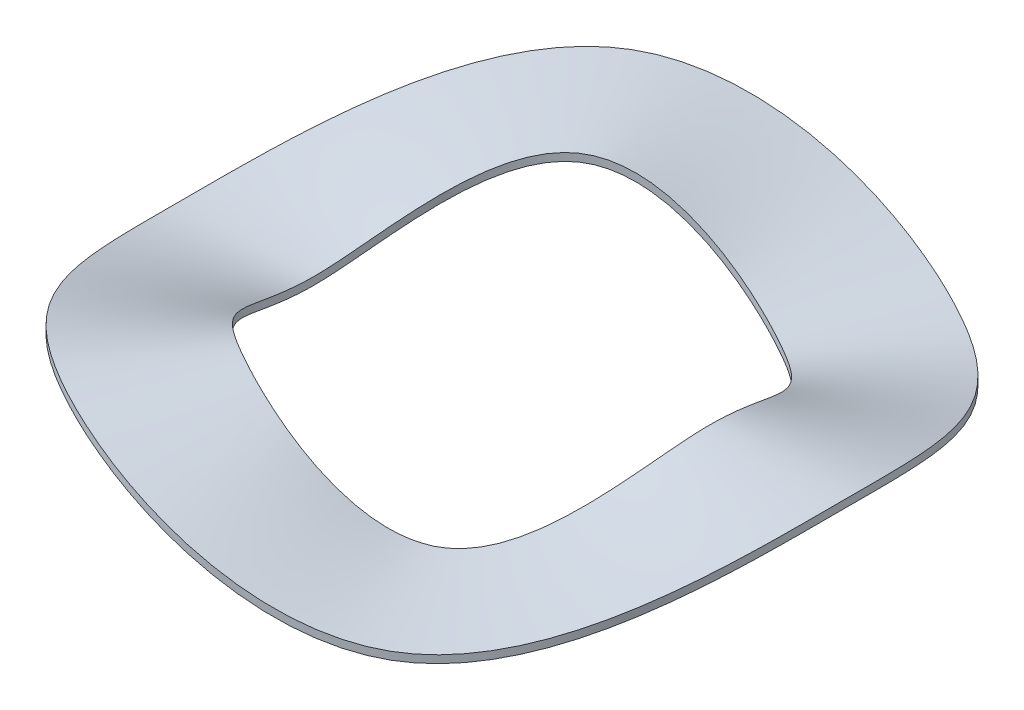
ISO-10303-21;
HEADER;
FILE_DESCRIPTION(('STEP AP214'),'2;1');
FILE_NAME('part.step','',(''),(''),'','','');
FILE_SCHEMA(('AUTOMOTIVE_DESIGN { 1 0 10303 214 1 1 1 1 }'));
ENDSEC;
DATA;
#1=APPLICATION_CONTEXT('core data for automotive mechanical design processes');
#2=APPLICATION_PROTOCOL_DEFINITION('international standard','automotive_design',2000,#1);
#3=PRODUCT_CONTEXT('',#1,'mechanical');
#4=PRODUCT('Part','Part','',(#3));
#5=PRODUCT_RELATED_PRODUCT_CATEGORY('part','',(#4));
#6=PRODUCT_DEFINITION_FORMATION('','',#4);
#7=PRODUCT_DEFINITION_CONTEXT('part definition',#1,'design');
#8=PRODUCT_DEFINITION('design','',#6,#7);
#9=PRODUCT_DEFINITION_SHAPE('','',#8);
#10=(LENGTH_UNIT() NAMED_UNIT(*) SI_UNIT(.MILLI.,.METRE.));
#11=(NAMED_UNIT(*) PLANE_ANGLE_UNIT() SI_UNIT($,.RADIAN.));
#12=(NAMED_UNIT(*) SI_UNIT($,.STERADIAN.) SOLID_ANGLE_UNIT());
#13=UNCERTAINTY_MEASURE_WITH_UNIT(LENGTH_MEASURE(1.E-05),#10,'distance_accuracy_value','');
#14=(GEOMETRIC_REPRESENTATION_CONTEXT(3) GLOBAL_UNCERTAINTY_ASSIGNED_CONTEXT((#13)) GLOBAL_UNIT_ASSIGNED_CONTEXT((#10,
#11,#12)) REPRESENTATION_CONTEXT('',''));
#15=CARTESIAN_POINT('',(0.,0.,0.));
#16=DIRECTION('',(0.,0.,1.));
#17=DIRECTION('',(1.,0.,0.));
#18=AXIS2_PLACEMENT_3D('',#15,#16,#17);
#19=CARTESIAN_POINT('',(-10.922,0.254,0.));
#20=CARTESIAN_POINT('',(-10.9219999999927,0.254000000001745,-0.189174589207381));
#21=CARTESIAN_POINT('',(-10.9110779999769,0.265557000005589,-0.567523767622859));
#22=CARTESIAN_POINT('',(-10.8627481499505,0.314096400012182,-1.1336287258289));
#23=CARTESIAN_POINT('',(-10.7832905999218,0.390372600019362,-1.69689606519844));
#24=CARTESIAN_POINT('',(-10.1246939997764,0.993648000028794,-5.05096153168188));
#25=CARTESIAN_POINT('',(-5.67943999942999,4.41451999999651,-11.3504753525087));
#26=CARTESIAN_POINT('',(6.55319999965251,-2.05740000005235,-11.3504753522481));
#27=CARTESIAN_POINT('',(13.106400000034,4.87680000000164,7.50304630708562E-11));
#28=CARTESIAN_POINT('',(6.55320000016817,-2.05740000000001,11.3504753520633));
#29=CARTESIAN_POINT('',(-5.67944000003358,4.41451999999847,11.3504753520914));
#30=CARTESIAN_POINT('',(-10.1246940001226,0.993647999976584,5.05096153178853));
#31=CARTESIAN_POINT('',(-10.7832906000527,0.390372599988579,1.69689606518149));
#32=CARTESIAN_POINT('',(-10.8627481500382,0.314096399991399,1.13362872582144));
#33=CARTESIAN_POINT('',(-10.9110780000209,0.26555699999512,0.567523767621429));
#34=CARTESIAN_POINT('',(-10.9220000000073,0.253999999998255,0.189174589207382));
#35=CARTESIAN_POINT('',(-10.922,0.254,0.));
#36=CARTESIAN_POINT('',(-9.46573333333333,0.254,0.));
#37=CARTESIAN_POINT('',(-9.46573333332698,0.254000000001745,-0.163951310646397));
#38=CARTESIAN_POINT('',(-9.45626759998001,0.265557000005589,-0.491853931939812));
#39=CARTESIAN_POINT('',(-9.41438172995713,0.314096400012181,-0.982478229051714));
#40=CARTESIAN_POINT('',(-9.34551851993219,0.390372600019362,-1.47064325650531));
#41=CARTESIAN_POINT('',(-8.77473479980619,0.993648000028794,-4.3774999941243));
#42=CARTESIAN_POINT('',(-4.92218133283933,4.41451999999651,-9.83707863884087));
#43=CARTESIAN_POINT('',(5.67943999969884,-2.05740000005235,-9.83707863861498));
#44=CARTESIAN_POINT('',(11.3588800000295,4.87680000000164,6.50259197616104E-11));
#45=CARTESIAN_POINT('',(5.67944000014575,-2.05740000000001,9.83707863845485));
#46=CARTESIAN_POINT('',(-4.92218133336243,4.41451999999847,9.83707863847919));
#47=CARTESIAN_POINT('',(-8.77473480010628,0.993647999976584,4.37749999421673));
#48=CARTESIAN_POINT('',(-9.34551852004565,0.390372599988579,1.47064325649063));
#49=CARTESIAN_POINT('',(-9.41438173003315,0.314096399991398,0.982478229045252));
#50=CARTESIAN_POINT('',(-9.45626760001813,0.265556999995119,0.491853931938572));
#51=CARTESIAN_POINT('',(-9.46573333333969,0.253999999998255,0.163951310646398));
#52=CARTESIAN_POINT('',(-9.46573333333333,0.254,0.));
#53=CARTESIAN_POINT('',(-8.00946666666667,0.254,0.));
#54=CARTESIAN_POINT('',(-8.00946666666129,0.254000000001745,-0.138728032085413));
#55=CARTESIAN_POINT('',(-8.00145719998308,0.265557000005589,-0.416184096256764));
#56=CARTESIAN_POINT('',(-7.96601530996372,0.314096400012182,-0.831327732274528));
#57=CARTESIAN_POINT('',(-7.90774643994262,0.390372600019362,-1.24439044781219));
#58=CARTESIAN_POINT('',(-7.42477559983601,0.993648000028794,-3.70403845656671));
#59=CARTESIAN_POINT('',(-4.16492266624866,4.41451999999651,-8.32368192517305));
#60=CARTESIAN_POINT('',(4.80567999974518,-2.05740000005235,-8.32368192498191));
#61=CARTESIAN_POINT('',(9.61136000002494,4.87680000000164,5.50217423705979E-11));
#62=CARTESIAN_POINT('',(4.80568000012333,-2.05740000000001,8.32368192484641));
#63=CARTESIAN_POINT('',(-4.16492266669129,4.41451999999847,8.323681924867));
#64=CARTESIAN_POINT('',(-7.42477560008993,0.993647999976584,3.70403845664492));
#65=CARTESIAN_POINT('',(-7.90774644003862,0.390372599988579,1.24439044779976));
#66=CARTESIAN_POINT('',(-7.96601531002805,0.314096399991399,0.831327732269059));
#67=CARTESIAN_POINT('',(-8.00145720001534,0.26555699999512,0.416184096255715));
#68=CARTESIAN_POINT('',(-8.00946666667204,0.253999999998255,0.138728032085413));
#69=CARTESIAN_POINT('',(-8.00946666666667,0.254,0.));
#70=CARTESIAN_POINT('',(-6.5532,0.254,0.));
#71=CARTESIAN_POINT('',(-6.5531999999956,0.254000000001745,-0.113504753524429));
#72=CARTESIAN_POINT('',(-6.54664679998616,0.265557000005589,-0.340514260573716));
#73=CARTESIAN_POINT('',(-6.51764888997032,0.314096400012182,-0.680177235497341));
#74=CARTESIAN_POINT('',(-6.46997435995305,0.390372600019362,-1.01813763911906));
#75=CARTESIAN_POINT('',(-6.07481639986583,0.993648000028794,-3.03057691900913));
#76=CARTESIAN_POINT('',(-3.407663999658,4.41451999999651,-6.81028521150522));
#77=CARTESIAN_POINT('',(3.93191999979151,-2.05740000005235,-6.81028521134883));
#78=CARTESIAN_POINT('',(7.8638400000204,4.87680000000164,4.50172532714607E-11));
#79=CARTESIAN_POINT('',(3.93192000010091,-2.05740000000001,6.81028521123798));
#80=CARTESIAN_POINT('',(-3.40766400002015,4.41451999999847,6.81028521125482));
#81=CARTESIAN_POINT('',(-6.07481640007358,0.993647999976584,3.03057691907312));
#82=CARTESIAN_POINT('',(-6.4699743600316,0.390372599988579,1.0181376391089));
#83=CARTESIAN_POINT('',(-6.51764889002295,0.314096399991399,0.680177235492866));
#84=CARTESIAN_POINT('',(-6.54664680001255,0.26555699999512,0.340514260572857));
#85=CARTESIAN_POINT('',(-6.5532000000044,0.253999999998255,0.113504753524429));
#86=CARTESIAN_POINT('',(-6.5532,0.254,0.));
#87=B_SPLINE_SURFACE_WITH_KNOTS('',3,3,((#19,#20,#21,#22,#23,#24,#25,#26,#27,#28,#29,#30,#31,
#32,#33,#34,#35),(#36,#37,#38,#39,#40,#41,#42,#43,#44,#45,#46,#47,#48,#49,#50,#51,#52),(#53,#54,
#55,#56,#57,#58,#59,#60,#61,#62,#63,#64,#65,#66,#67,#68,#69),(#70,#71,#72,#73,#74,#75,#76,#77,
#78,#79,#80,#81,#82,#83,#84,#85,#86)),.UNSPECIFIED.,.F.,.T.,.F.,(4,4),(4,1,1,1,1,1,1,1,1,1,1,1,
1,1,4),(0.,1.),(0.,0.0083333333333333,0.0166666666666666,0.0250000000000001,0.0333333333333334,
0.166666666657779,0.333333333333334,0.5,0.66666666666946,0.833333333333334,0.966666666666667,
0.975,0.983333333333333,0.991666666666667,1.),.UNSPECIFIED.);
#88=CARTESIAN_POINT('',(-10.922,0.254,0.));
#89=CARTESIAN_POINT('',(-10.9219999999927,0.254000000001745,-0.189174589207381));
#90=CARTESIAN_POINT('',(-10.9110779999769,0.265557000005589,-0.567523767622859));
#91=CARTESIAN_POINT('',(-10.8627481499505,0.314096400012182,-1.1336287258289));
#92=CARTESIAN_POINT('',(-10.7832905999218,0.390372600019362,-1.69689606519844));
#93=CARTESIAN_POINT('',(-10.1246939997764,0.993648000028794,-5.05096153168188));
#94=CARTESIAN_POINT('',(-5.67943999942999,4.41451999999651,-11.3504753525087));
#95=CARTESIAN_POINT('',(6.55319999965251,-2.05740000005235,-11.3504753522481));
#96=CARTESIAN_POINT('',(13.106400000034,4.87680000000164,7.50304630708562E-11));
#97=CARTESIAN_POINT('',(6.55320000016817,-2.05740000000001,11.3504753520633));
#98=CARTESIAN_POINT('',(-5.67944000003358,4.41451999999847,11.3504753520914));
#99=CARTESIAN_POINT('',(-10.1246940001226,0.993647999976584,5.05096153178853));
#100=CARTESIAN_POINT('',(-10.7832906000527,0.390372599988579,1.69689606518149));
#101=CARTESIAN_POINT('',(-10.8627481500382,0.314096399991399,1.13362872582144));
#102=CARTESIAN_POINT('',(-10.9110780000209,0.26555699999512,0.567523767621429));
#103=CARTESIAN_POINT('',(-10.9220000000073,0.253999999998255,0.189174589207382));
#104=CARTESIAN_POINT('',(-10.922,0.254,0.));
#105=B_SPLINE_CURVE_WITH_KNOTS('',3,(#88,#89,#90,#91,#92,#93,#94,#95,#96,#97,#98,#99,#100,#101,
#102,#103,#104),.UNSPECIFIED.,.T.,.F.,(4,1,1,1,1,1,1,1,1,1,1,1,1,1,4),(0.,0.0083333333333333,
0.0166666666666666,0.0250000000000001,0.0333333333333334,0.166666666657779,0.333333333333334,
0.5,0.66666666666946,0.833333333333334,0.966666666666667,0.975,0.983333333333333,
0.991666666666667,1.),.UNSPECIFIED.);
#106=CARTESIAN_POINT('',(-10.922,0.254,0.));
#107=VERTEX_POINT('',#106);
#108=EDGE_CURVE('E11',#107,#107,#105,.F.);
#109=CARTESIAN_POINT('',(-6.5532,0.254,0.));
#110=CARTESIAN_POINT('',(-6.5531999999956,0.254000000001745,-0.113504753524429));
#111=CARTESIAN_POINT('',(-6.54664679998616,0.265557000005589,-0.340514260573716));
#112=CARTESIAN_POINT('',(-6.51764888997032,0.314096400012182,-0.680177235497341));
#113=CARTESIAN_POINT('',(-6.46997435995305,0.390372600019362,-1.01813763911906));
#114=CARTESIAN_POINT('',(-6.07481639986583,0.993648000028794,-3.03057691900913));
#115=CARTESIAN_POINT('',(-3.407663999658,4.41451999999651,-6.81028521150522));
#116=CARTESIAN_POINT('',(3.93191999979151,-2.05740000005235,-6.81028521134883));
#117=CARTESIAN_POINT('',(7.8638400000204,4.87680000000164,4.50172532714607E-11));
#118=CARTESIAN_POINT('',(3.93192000010091,-2.05740000000001,6.81028521123798));
#119=CARTESIAN_POINT('',(-3.40766400002015,4.41451999999847,6.81028521125482));
#120=CARTESIAN_POINT('',(-6.07481640007358,0.993647999976584,3.03057691907312));
#121=CARTESIAN_POINT('',(-6.4699743600316,0.390372599988579,1.0181376391089));
#122=CARTESIAN_POINT('',(-6.51764889002295,0.314096399991399,0.680177235492866));
#123=CARTESIAN_POINT('',(-6.54664680001255,0.26555699999512,0.340514260572857));
#124=CARTESIAN_POINT('',(-6.5532000000044,0.253999999998255,0.113504753524429));
#125=CARTESIAN_POINT('',(-6.5532,0.254,0.));
#126=B_SPLINE_CURVE_WITH_KNOTS('',3,(#109,#110,#111,#112,#113,#114,#115,#116,#117,#118,#119,
#120,#121,#122,#123,#124,#125),.UNSPECIFIED.,.T.,.F.,(4,1,1,1,1,1,1,1,1,1,1,1,1,1,4),(0.,
0.0083333333333333,0.0166666666666666,0.0250000000000001,0.0333333333333334,0.166666666657779,
0.333333333333334,0.5,0.66666666666946,0.833333333333334,0.966666666666667,0.975,
0.983333333333333,0.991666666666667,1.),.UNSPECIFIED.);
#127=CARTESIAN_POINT('',(-6.5532,0.254,0.));
#128=VERTEX_POINT('',#127);
#129=EDGE_CURVE('E58',#128,#128,#126,.T.);
#130=ORIENTED_EDGE('',*,*,#108,.T.);
#131=EDGE_LOOP('',(#130));
#132=FACE_BOUND('',#131,.T.);
#133=ORIENTED_EDGE('',*,*,#129,.T.);
#134=EDGE_LOOP('',(#133));
#135=FACE_BOUND('',#134,.T.);
#136=ADVANCED_FACE('F46',(#132,#135),#87,.T.);
#137=CARTESIAN_POINT('',(-10.922,0.,0.));
#138=CARTESIAN_POINT('',(-10.9219999999927,1.74474726387461E-12,-0.189174589207381));
#139=CARTESIAN_POINT('',(-10.9110779999769,0.0115570000055891,-0.567523767622859));
#140=CARTESIAN_POINT('',(-10.8627481499505,0.0600964000121815,-1.1336287258289));
#141=CARTESIAN_POINT('',(-10.7832905999218,0.136372600019362,-1.69689606519843));
#142=CARTESIAN_POINT('',(-10.1246939997764,0.739648000028794,-5.05096153168188));
#143=CARTESIAN_POINT('',(-5.67943999942999,4.16051999999651,-11.3504753525087));
#144=CARTESIAN_POINT('',(6.55319999965251,-2.31140000005235,-11.3504753522481));
#145=CARTESIAN_POINT('',(13.106400000034,4.62280000000164,7.50308018840351E-11));
#146=CARTESIAN_POINT('',(6.55320000016817,-2.31140000000001,11.3504753520633));
#147=CARTESIAN_POINT('',(-5.67944000003358,4.16051999999847,11.3504753520914));
#148=CARTESIAN_POINT('',(-10.1246940001226,0.739647999976584,5.05096153178853));
#149=CARTESIAN_POINT('',(-10.7832906000527,0.136372599988579,1.69689606518149));
#150=CARTESIAN_POINT('',(-10.8627481500383,0.0600963999913984,1.13362872582144));
#151=CARTESIAN_POINT('',(-10.9110780000209,0.0115569999951193,0.567523767621429));
#152=CARTESIAN_POINT('',(-10.9220000000073,-1.74519957946845E-12,0.189174589207381));
#153=CARTESIAN_POINT('',(-10.922,0.,0.));
#154=CARTESIAN_POINT('',(-10.922,0.0211666666666664,0.));
#155=CARTESIAN_POINT('',(-10.9219999999927,0.0211666666684114,-0.189174589207381));
#156=CARTESIAN_POINT('',(-10.9110779999769,0.0327236666722557,-0.567523767622859));
#157=CARTESIAN_POINT('',(-10.8627481499505,0.081263066678848,-1.1336287258289));
#158=CARTESIAN_POINT('',(-10.7832905999218,0.157539266686028,-1.69689606519843));
#159=CARTESIAN_POINT('',(-10.1246939997764,0.760814666695461,-5.05096153168188));
#160=CARTESIAN_POINT('',(-5.67943999942999,4.18168666666318,-11.3504753525087));
#161=CARTESIAN_POINT('',(6.55319999965251,-2.29023333338569,-11.3504753522481));
#162=CARTESIAN_POINT('',(13.106400000034,4.6439666666683,7.50307747789808E-11));
#163=CARTESIAN_POINT('',(6.55320000016817,-2.29023333333334,11.3504753520633));
#164=CARTESIAN_POINT('',(-5.67944000003357,4.18168666666513,11.3504753520914));
#165=CARTESIAN_POINT('',(-10.1246940001226,0.760814666643251,5.05096153178853));
#166=CARTESIAN_POINT('',(-10.7832906000527,0.157539266655246,1.69689606518149));
#167=CARTESIAN_POINT('',(-10.8627481500382,0.0812630666580651,1.13362872582144));
#168=CARTESIAN_POINT('',(-10.9110780000209,0.032723666661786,0.567523767621429));
#169=CARTESIAN_POINT('',(-10.9220000000073,0.0211666666649214,0.189174589207381));
#170=CARTESIAN_POINT('',(-10.922,0.0211666666666664,0.));
#171=CARTESIAN_POINT('',(-10.922,0.0634999999999999,0.));
#172=CARTESIAN_POINT('',(-10.9219999999927,0.0635000000017448,-0.189174589207382));
#173=CARTESIAN_POINT('',(-10.9110779999769,0.0750570000055892,-0.56752376762286));
#174=CARTESIAN_POINT('',(-10.8627481499505,0.123596400012181,-1.1336287258289));
#175=CARTESIAN_POINT('',(-10.7832905999218,0.199872600019361,-1.69689606519843));
#176=CARTESIAN_POINT('',(-10.1246939997764,0.803148000028793,-5.05096153168188));
#177=CARTESIAN_POINT('',(-5.67943999942998,4.22401999999651,-11.3504753525087));
#178=CARTESIAN_POINT('',(6.55319999965251,-2.24790000005235,-11.350475352248));
#179=CARTESIAN_POINT('',(13.106400000034,4.68630000000164,7.50282269038755E-11));
#180=CARTESIAN_POINT('',(6.55320000016818,-2.2479,11.3504753520633));
#181=CARTESIAN_POINT('',(-5.67944000003358,4.22401999999846,11.3504753520914));
#182=CARTESIAN_POINT('',(-10.1246940001226,0.803147999976584,5.05096153178853));
#183=CARTESIAN_POINT('',(-10.7832906000527,0.199872599988579,1.69689606518149));
#184=CARTESIAN_POINT('',(-10.8627481500383,0.123596399991399,1.13362872582144));
#185=CARTESIAN_POINT('',(-10.9110780000209,0.0750569999951194,0.567523767621429));
#186=CARTESIAN_POINT('',(-10.9220000000073,0.0634999999982549,0.189174589207381));
#187=CARTESIAN_POINT('',(-10.922,0.0634999999999999,0.));
#188=CARTESIAN_POINT('',(-10.922,0.127,0.));
#189=CARTESIAN_POINT('',(-10.9219999999927,0.127000000001745,-0.189174589207382));
#190=CARTESIAN_POINT('',(-10.9110779999769,0.138557000005589,-0.56752376762286));
#191=CARTESIAN_POINT('',(-10.8627481499505,0.187096400012182,-1.1336287258289));
#192=CARTESIAN_POINT('',(-10.7832905999217,0.263372600019362,-1.69689606519844));
#193=CARTESIAN_POINT('',(-10.1246939997764,0.866648000028796,-5.05096153168189));
#194=CARTESIAN_POINT('',(-5.67943999943,4.28751999999652,-11.3504753525087));
#195=CARTESIAN_POINT('',(6.5531999996525,-2.18440000005236,-11.3504753522481));
#196=CARTESIAN_POINT('',(13.106400000034,4.74980000000165,7.5038431956824E-11));
#197=CARTESIAN_POINT('',(6.55320000016817,-2.18440000000001,11.3504753520633));
#198=CARTESIAN_POINT('',(-5.67944000003357,4.28751999999848,11.3504753520914));
#199=CARTESIAN_POINT('',(-10.1246940001226,0.866647999976585,5.05096153178853));
#200=CARTESIAN_POINT('',(-10.7832906000527,0.263372599988579,1.69689606518149));
#201=CARTESIAN_POINT('',(-10.8627481500382,0.187096399991399,1.13362872582144));
#202=CARTESIAN_POINT('',(-10.9110780000209,0.13855699999512,0.567523767621429));
#203=CARTESIAN_POINT('',(-10.9220000000073,0.126999999998255,0.189174589207382));
#204=CARTESIAN_POINT('',(-10.922,0.127,0.));
#205=CARTESIAN_POINT('',(-10.922,0.1905,0.));
#206=CARTESIAN_POINT('',(-10.9219999999927,0.190500000001745,-0.189174589207382));
#207=CARTESIAN_POINT('',(-10.9110779999769,0.202057000005589,-0.56752376762286));
#208=CARTESIAN_POINT('',(-10.8627481499505,0.250596400012182,-1.1336287258289));
#209=CARTESIAN_POINT('',(-10.7832905999218,0.326872600019362,-1.69689606519843));
#210=CARTESIAN_POINT('',(-10.1246939997764,0.930148000028793,-5.05096153168188));
#211=CARTESIAN_POINT('',(-5.67943999942999,4.35101999999651,-11.3504753525087));
#212=CARTESIAN_POINT('',(6.55319999965251,-2.12090000005235,-11.350475352248));
#213=CARTESIAN_POINT('',(13.106400000034,4.81330000000163,7.5022453527307E-11));
#214=CARTESIAN_POINT('',(6.55320000016818,-2.1209,11.3504753520633));
#215=CARTESIAN_POINT('',(-5.67944000003358,4.35101999999846,11.3504753520914));
#216=CARTESIAN_POINT('',(-10.1246940001226,0.930147999976583,5.05096153178852));
#217=CARTESIAN_POINT('',(-10.7832906000527,0.326872599988579,1.69689606518149));
#218=CARTESIAN_POINT('',(-10.8627481500383,0.250596399991399,1.13362872582144));
#219=CARTESIAN_POINT('',(-10.9110780000209,0.20205699999512,0.567523767621428));
#220=CARTESIAN_POINT('',(-10.9220000000073,0.190499999998255,0.189174589207381));
#221=CARTESIAN_POINT('',(-10.922,0.1905,0.));
#222=CARTESIAN_POINT('',(-10.922,0.232833333333333,0.));
#223=CARTESIAN_POINT('',(-10.9219999999927,0.232833333335078,-0.189174589207381));
#224=CARTESIAN_POINT('',(-10.9110779999769,0.244390333338923,-0.567523767622859));
#225=CARTESIAN_POINT('',(-10.8627481499505,0.292929733345515,-1.1336287258289));
#226=CARTESIAN_POINT('',(-10.7832905999218,0.369205933352695,-1.69689606519843));
#227=CARTESIAN_POINT('',(-10.1246939997764,0.972481333362128,-5.05096153168188));
#228=CARTESIAN_POINT('',(-5.67943999942999,4.39335333332985,-11.3504753525087));
#229=CARTESIAN_POINT('',(6.55319999965251,-2.07856666671902,-11.3504753522481));
#230=CARTESIAN_POINT('',(13.106400000034,4.85563333333497,7.50293382111022E-11));
#231=CARTESIAN_POINT('',(6.55320000016818,-2.07856666666667,11.3504753520633));
#232=CARTESIAN_POINT('',(-5.67944000003357,4.3933533333318,11.3504753520914));
#233=CARTESIAN_POINT('',(-10.1246940001226,0.972481333309917,5.05096153178853));
#234=CARTESIAN_POINT('',(-10.7832906000527,0.369205933321913,1.69689606518149));
#235=CARTESIAN_POINT('',(-10.8627481500382,0.292929733324732,1.13362872582144));
#236=CARTESIAN_POINT('',(-10.9110780000209,0.244390333328453,0.567523767621429));
#237=CARTESIAN_POINT('',(-10.9220000000073,0.232833333331588,0.189174589207382));
#238=CARTESIAN_POINT('',(-10.922,0.232833333333333,0.));
#239=CARTESIAN_POINT('',(-10.922,0.254,0.));
#240=CARTESIAN_POINT('',(-10.9219999999927,0.254000000001745,-0.189174589207381));
#241=CARTESIAN_POINT('',(-10.9110779999769,0.265557000005589,-0.567523767622859));
#242=CARTESIAN_POINT('',(-10.8627481499505,0.314096400012182,-1.1336287258289));
#243=CARTESIAN_POINT('',(-10.7832905999218,0.390372600019362,-1.69689606519843));
#244=CARTESIAN_POINT('',(-10.1246939997764,0.993648000028794,-5.05096153168188));
#245=CARTESIAN_POINT('',(-5.67943999942999,4.41451999999651,-11.3504753525087));
#246=CARTESIAN_POINT('',(6.55319999965251,-2.05740000005235,-11.3504753522481));
#247=CARTESIAN_POINT('',(13.106400000034,4.87680000000164,7.50300836000958E-11));
#248=CARTESIAN_POINT('',(6.55320000016818,-2.05740000000001,11.3504753520633));
#249=CARTESIAN_POINT('',(-5.67944000003358,4.41451999999847,11.3504753520914));
#250=CARTESIAN_POINT('',(-10.1246940001226,0.993647999976584,5.05096153178853));
#251=CARTESIAN_POINT('',(-10.7832906000527,0.390372599988579,1.69689606518149));
#252=CARTESIAN_POINT('',(-10.8627481500382,0.314096399991399,1.13362872582144));
#253=CARTESIAN_POINT('',(-10.9110780000209,0.26555699999512,0.567523767621429));
#254=CARTESIAN_POINT('',(-10.9220000000073,0.253999999998255,0.189174589207382));
#255=CARTESIAN_POINT('',(-10.922,0.254,0.));
#256=B_SPLINE_SURFACE_WITH_KNOTS('',3,3,((#137,#138,#139,#140,#141,#142,#143,#144,#145,#146,
#147,#148,#149,#150,#151,#152,#153),(#154,#155,#156,#157,#158,#159,#160,#161,#162,#163,#164,
#165,#166,#167,#168,#169,#170),(#171,#172,#173,#174,#175,#176,#177,#178,#179,#180,#181,#182,
#183,#184,#185,#186,#187),(#188,#189,#190,#191,#192,#193,#194,#195,#196,#197,#198,#199,#200,
#201,#202,#203,#204),(#205,#206,#207,#208,#209,#210,#211,#212,#213,#214,#215,#216,#217,#218,
#219,#220,#221),(#222,#223,#224,#225,#226,#227,#228,#229,#230,#231,#232,#233,#234,#235,#236,
#237,#238),(#239,#240,#241,#242,#243,#244,#245,#246,#247,#248,#249,#250,#251,#252,#253,#254,
#255)),.UNSPECIFIED.,.F.,.T.,.F.,(4,1,1,1,4),(4,1,1,1,1,1,1,1,1,1,1,1,1,1,4),(0.947916666666667,
0.9609375,0.973958333333333,0.986979166666667,1.),(0.,0.0083333333333333,0.0166666666666666,
0.0250000000000001,0.0333333333333334,0.166666666657779,0.333333333333334,0.5,0.66666666666946,
0.833333333333334,0.966666666666667,0.975,0.983333333333333,0.991666666666667,1.),.UNSPECIFIED.);
#257=CARTESIAN_POINT('',(-10.922,0.,0.));
#258=CARTESIAN_POINT('',(-10.9219999999927,1.74474726387461E-12,-0.189174589207381));
#259=CARTESIAN_POINT('',(-10.9110779999769,0.0115570000055891,-0.567523767622859));
#260=CARTESIAN_POINT('',(-10.8627481499505,0.0600964000121815,-1.1336287258289));
#261=CARTESIAN_POINT('',(-10.7832905999218,0.136372600019362,-1.69689606519843));
#262=CARTESIAN_POINT('',(-10.1246939997764,0.739648000028794,-5.05096153168188));
#263=CARTESIAN_POINT('',(-5.67943999942999,4.16051999999651,-11.3504753525087));
#264=CARTESIAN_POINT('',(6.55319999965251,-2.31140000005235,-11.3504753522481));
#265=CARTESIAN_POINT('',(13.106400000034,4.62280000000164,7.50308018840351E-11));
#266=CARTESIAN_POINT('',(6.55320000016817,-2.31140000000001,11.3504753520633));
#267=CARTESIAN_POINT('',(-5.67944000003358,4.16051999999847,11.3504753520914));
#268=CARTESIAN_POINT('',(-10.1246940001226,0.739647999976584,5.05096153178853));
#269=CARTESIAN_POINT('',(-10.7832906000527,0.136372599988579,1.69689606518149));
#270=CARTESIAN_POINT('',(-10.8627481500383,0.0600963999913984,1.13362872582144));
#271=CARTESIAN_POINT('',(-10.9110780000209,0.0115569999951193,0.567523767621429));
#272=CARTESIAN_POINT('',(-10.9220000000073,-1.74519957946845E-12,0.189174589207381));
#273=CARTESIAN_POINT('',(-10.922,0.,0.));
#274=B_SPLINE_CURVE_WITH_KNOTS('',3,(#257,#258,#259,#260,#261,#262,#263,#264,#265,#266,#267,
#268,#269,#270,#271,#272,#273),.UNSPECIFIED.,.T.,.F.,(4,1,1,1,1,1,1,1,1,1,1,1,1,1,4),(0.,
0.0083333333333333,0.0166666666666666,0.0250000000000001,0.0333333333333334,0.166666666657779,
0.333333333333334,0.5,0.66666666666946,0.833333333333334,0.966666666666667,0.975,
0.983333333333333,0.991666666666667,1.),.UNSPECIFIED.);
#275=CARTESIAN_POINT('',(-10.922,0.,0.));
#276=VERTEX_POINT('',#275);
#277=EDGE_CURVE('E52',#276,#276,#274,.T.);
#278=ORIENTED_EDGE('',*,*,#108,.F.);
#279=EDGE_LOOP('',(#278));
#280=FACE_BOUND('',#279,.T.);
#281=ORIENTED_EDGE('',*,*,#277,.F.);
#282=EDGE_LOOP('',(#281));
#283=FACE_BOUND('',#282,.T.);
#284=ADVANCED_FACE('F48',(#280,#283),#256,.T.);
#285=CARTESIAN_POINT('',(-6.5532,0.,0.));
#286=CARTESIAN_POINT('',(-6.5531999999956,1.74495902211143E-12,-0.113504753524429));
#287=CARTESIAN_POINT('',(-6.54664679998616,0.0115570000055894,-0.340514260573716));
#288=CARTESIAN_POINT('',(-6.51764888997032,0.0600964000121817,-0.680177235497341));
#289=CARTESIAN_POINT('',(-6.46997435995305,0.136372600019362,-1.01813763911906));
#290=CARTESIAN_POINT('',(-6.07481639986583,0.739648000028794,-3.03057691900913));
#291=CARTESIAN_POINT('',(-3.407663999658,4.16051999999651,-6.81028521150522));
#292=CARTESIAN_POINT('',(3.93191999979151,-2.31140000005235,-6.81028521134883));
#293=CARTESIAN_POINT('',(7.86384000002041,4.62280000000164,4.50169212345454E-11));
#294=CARTESIAN_POINT('',(3.93192000010091,-2.31140000000001,6.81028521123797));
#295=CARTESIAN_POINT('',(-3.40766400002015,4.16051999999847,6.81028521125482));
#296=CARTESIAN_POINT('',(-6.07481640007358,0.739647999976584,3.03057691907312));
#297=CARTESIAN_POINT('',(-6.4699743600316,0.136372599988579,1.0181376391089));
#298=CARTESIAN_POINT('',(-6.51764889002295,0.0600963999913986,0.680177235492867));
#299=CARTESIAN_POINT('',(-6.54664680001255,0.0115569999951195,0.340514260572858));
#300=CARTESIAN_POINT('',(-6.5532000000044,-1.74499290342932E-12,0.113504753524429));
#301=CARTESIAN_POINT('',(-6.5532,0.,0.));
#302=CARTESIAN_POINT('',(-6.91726666666667,0.,0.));
#303=CARTESIAN_POINT('',(-6.91726666666202,1.74495902211143E-12,-0.119810573164675));
#304=CARTESIAN_POINT('',(-6.91034939998539,0.0115570000055894,-0.359431719494478));
#305=CARTESIAN_POINT('',(-6.87974049496867,0.0600964000121817,-0.717964859691637));
#306=CARTESIAN_POINT('',(-6.82941737995045,0.136372600019362,-1.07470084129234));
#307=CARTESIAN_POINT('',(-6.41230619985837,0.739648000028794,-3.19894230339853));
#308=CARTESIAN_POINT('',(-3.59697866630566,4.16051999999651,-7.18863438992217));
#309=CARTESIAN_POINT('',(4.15035999977992,-2.31140000005235,-7.1886343897571));
#310=CARTESIAN_POINT('',(8.30072000002154,4.62280000000164,4.75188329440365E-11));
#311=CARTESIAN_POINT('',(4.15036000010651,-2.31140000000001,7.18863438964008));
#312=CARTESIAN_POINT('',(-3.59697866668793,4.16051999999847,7.18863438965787));
#313=CARTESIAN_POINT('',(-6.41230620007767,0.739647999976584,3.19894230346607));
#314=CARTESIAN_POINT('',(-6.82941738003336,0.136372599988579,1.07470084128161));
#315=CARTESIAN_POINT('',(-6.87974049502423,0.0600963999913986,0.717964859686915));
#316=CARTESIAN_POINT('',(-6.91034940001325,0.0115569999951195,0.359431719493572));
#317=CARTESIAN_POINT('',(-6.91726666667131,-1.74499290342932E-12,0.119810573164675));
#318=CARTESIAN_POINT('',(-6.91726666666667,0.,0.));
#319=CARTESIAN_POINT('',(-7.64539999999999,0.,0.));
#320=CARTESIAN_POINT('',(-7.64539999999486,1.74484806079534E-12,-0.132422212445166));
#321=CARTESIAN_POINT('',(-7.63775459998384,0.0115570000055892,-0.397266637336001));
#322=CARTESIAN_POINT('',(-7.60392370496536,0.0600964000121814,-0.79354010808023));
#323=CARTESIAN_POINT('',(-7.54830341994522,0.136372600019362,-1.1878272456389));
#324=CARTESIAN_POINT('',(-7.08728579984346,0.739648000028794,-3.53567307217732));
#325=CARTESIAN_POINT('',(-3.97560799960101,4.16051999999651,-7.94533274675608));
#326=CARTESIAN_POINT('',(4.58723999975677,-2.31140000005235,-7.94533274657364));
#327=CARTESIAN_POINT('',(9.17448000002379,4.62280000000164,5.25262884402966E-11));
#328=CARTESIAN_POINT('',(4.58724000011773,-2.31140000000001,7.94533274644428));
#329=CARTESIAN_POINT('',(-3.97560800002351,4.16051999999847,7.94533274646397));
#330=CARTESIAN_POINT('',(-7.08728580008583,0.739647999976584,3.53567307225197));
#331=CARTESIAN_POINT('',(-7.54830342003686,0.136372599988579,1.18782724562705));
#332=CARTESIAN_POINT('',(-7.60392370502677,0.0600963999913987,0.793540108075012));
#333=CARTESIAN_POINT('',(-7.63775460001464,0.0115569999951195,0.397266637335001));
#334=CARTESIAN_POINT('',(-7.64540000000512,-1.7450445724391E-12,0.132422212445168));
#335=CARTESIAN_POINT('',(-7.64539999999999,0.,0.));
#336=CARTESIAN_POINT('',(-8.73760000000001,0.,0.));
#337=CARTESIAN_POINT('',(-8.73759999999415,1.74463545552558E-12,-0.151339671365905));
#338=CARTESIAN_POINT('',(-8.72886239998156,0.011557000005589,-0.454019014098288));
#339=CARTESIAN_POINT('',(-8.69019851996044,0.0600964000121813,-0.906902980663121));
#340=CARTESIAN_POINT('',(-8.62663247993742,0.136372600019362,-1.35751685215875));
#341=CARTESIAN_POINT('',(-8.09975519982111,0.739648000028794,-4.04076922534551));
#342=CARTESIAN_POINT('',(-4.54355199954397,4.16051999999652,-9.08038028200697));
#343=CARTESIAN_POINT('',(5.242559999722,-2.31140000005236,-9.08038028179845));
#344=CARTESIAN_POINT('',(10.4851200000272,4.62280000000164,6.00191825492896E-11));
#345=CARTESIAN_POINT('',(5.24256000013453,-2.31140000000001,9.08038028165065));
#346=CARTESIAN_POINT('',(-4.54355200002686,4.16051999999847,9.0803802816731));
#347=CARTESIAN_POINT('',(-8.09975520009812,0.739647999976584,4.04076922543082));
#348=CARTESIAN_POINT('',(-8.62663248004215,0.136372599988579,1.3575168521452));
#349=CARTESIAN_POINT('',(-8.69019852003061,0.0600963999913983,0.906902980657156));
#350=CARTESIAN_POINT('',(-8.72886240001675,0.0115569999951192,0.454019014097143));
#351=CARTESIAN_POINT('',(-8.73760000000588,-1.74529868232328E-12,0.151339671365905));
#352=CARTESIAN_POINT('',(-8.73760000000001,0.,0.));
#353=CARTESIAN_POINT('',(-9.82979999999999,0.,0.));
#354=CARTESIAN_POINT('',(-9.82979999999339,1.74517840364477E-12,-0.170257130286643));
#355=CARTESIAN_POINT('',(-9.81997019997923,0.0115570000055896,-0.510771390860573));
#356=CARTESIAN_POINT('',(-9.77647333495547,0.0600964000121819,-1.02026585324601));
#357=CARTESIAN_POINT('',(-9.70496153992958,0.136372600019362,-1.52720645867859));
#358=CARTESIAN_POINT('',(-9.11222459979874,0.739648000028795,-4.54586537851369));
#359=CARTESIAN_POINT('',(-5.11149599948701,4.16051999999651,-10.2154278172578));
#360=CARTESIAN_POINT('',(5.89787999968727,-2.31140000005235,-10.2154278170232));
#361=CARTESIAN_POINT('',(11.7957600000306,4.62280000000164,6.75302912547804E-11));
#362=CARTESIAN_POINT('',(5.89788000015137,-2.31140000000001,10.2154278168569));
#363=CARTESIAN_POINT('',(-5.11149600003022,4.16051999999847,10.2154278168822));
#364=CARTESIAN_POINT('',(-9.11222460011036,0.739647999976583,4.54586537860968));
#365=CARTESIAN_POINT('',(-9.70496154004739,0.136372599988579,1.52720645866334));
#366=CARTESIAN_POINT('',(-9.77647333503442,0.0600963999913988,1.0202658532393));
#367=CARTESIAN_POINT('',(-9.81997020001883,0.0115569999951197,0.510771390859286));
#368=CARTESIAN_POINT('',(-9.82980000000659,-1.74477775706072E-12,0.170257130286644));
#369=CARTESIAN_POINT('',(-9.82979999999999,0.,0.));
#370=CARTESIAN_POINT('',(-10.5579333333333,0.,0.));
#371=CARTESIAN_POINT('',(-10.5579333333262,1.74474726387461E-12,-0.182868769567135));
#372=CARTESIAN_POINT('',(-10.5473753999777,0.0115570000055891,-0.548606308702097));
#373=CARTESIAN_POINT('',(-10.5006565449522,0.0600964000121815,-1.0958411016346));
#374=CARTESIAN_POINT('',(-10.4238475799244,0.136372600019362,-1.64033286302515));
#375=CARTESIAN_POINT('',(-9.78720419978383,0.739648000028794,-4.88259614729249));
#376=CARTESIAN_POINT('',(-5.49012533278232,4.16051999999651,-10.9721261740917));
#377=CARTESIAN_POINT('',(6.33475999966409,-2.31140000005235,-10.9721261738398));
#378=CARTESIAN_POINT('',(12.6695200000329,4.62280000000164,7.25298862852899E-11));
#379=CARTESIAN_POINT('',(6.33476000016257,-2.31140000000001,10.9721261736612));
#380=CARTESIAN_POINT('',(-5.49012533336579,4.16051999999847,10.9721261736883));
#381=CARTESIAN_POINT('',(-9.78720420011854,0.739647999976584,4.88259614739558));
#382=CARTESIAN_POINT('',(-10.4238475800509,0.136372599988579,1.64033286300878));
#383=CARTESIAN_POINT('',(-10.500656545037,0.0600963999913984,1.0958411016274));
#384=CARTESIAN_POINT('',(-10.5473754000202,0.0115569999951193,0.548606308700715));
#385=CARTESIAN_POINT('',(-10.5579333333404,-1.74519957946845E-12,0.182868769567136));
#386=CARTESIAN_POINT('',(-10.5579333333333,0.,0.));
#387=CARTESIAN_POINT('',(-10.922,0.,0.));
#388=CARTESIAN_POINT('',(-10.9219999999927,1.74474726387461E-12,-0.189174589207381));
#389=CARTESIAN_POINT('',(-10.9110779999769,0.0115570000055891,-0.567523767622859));
#390=CARTESIAN_POINT('',(-10.8627481499505,0.0600964000121815,-1.1336287258289));
#391=CARTESIAN_POINT('',(-10.7832905999218,0.136372600019362,-1.69689606519843));
#392=CARTESIAN_POINT('',(-10.1246939997764,0.739648000028794,-5.05096153168188));
#393=CARTESIAN_POINT('',(-5.67943999942999,4.16051999999651,-11.3504753525087));
#394=CARTESIAN_POINT('',(6.55319999965251,-2.31140000005235,-11.3504753522481));
#395=CARTESIAN_POINT('',(13.106400000034,4.62280000000164,7.50308018840351E-11));
#396=CARTESIAN_POINT('',(6.55320000016817,-2.31140000000001,11.3504753520633));
#397=CARTESIAN_POINT('',(-5.67944000003358,4.16051999999847,11.3504753520914));
#398=CARTESIAN_POINT('',(-10.1246940001226,0.739647999976584,5.05096153178853));
#399=CARTESIAN_POINT('',(-10.7832906000527,0.136372599988579,1.69689606518149));
#400=CARTESIAN_POINT('',(-10.8627481500383,0.0600963999913984,1.13362872582144));
#401=CARTESIAN_POINT('',(-10.9110780000209,0.0115569999951193,0.567523767621429));
#402=CARTESIAN_POINT('',(-10.9220000000073,-1.74519957946845E-12,0.189174589207381));
#403=CARTESIAN_POINT('',(-10.922,0.,0.));
#404=B_SPLINE_SURFACE_WITH_KNOTS('',3,3,((#285,#286,#287,#288,#289,#290,#291,#292,#293,#294,
#295,#296,#297,#298,#299,#300,#301),(#302,#303,#304,#305,#306,#307,#308,#309,#310,#311,#312,
#313,#314,#315,#316,#317,#318),(#319,#320,#321,#322,#323,#324,#325,#326,#327,#328,#329,#330,
#331,#332,#333,#334,#335),(#336,#337,#338,#339,#340,#341,#342,#343,#344,#345,#346,#347,#348,
#349,#350,#351,#352),(#353,#354,#355,#356,#357,#358,#359,#360,#361,#362,#363,#364,#365,#366,
#367,#368,#369),(#370,#371,#372,#373,#374,#375,#376,#377,#378,#379,#380,#381,#382,#383,#384,
#385,#386),(#387,#388,#389,#390,#391,#392,#393,#394,#395,#396,#397,#398,#399,#400,#401,#402,
#403)),.UNSPECIFIED.,.F.,.T.,.F.,(4,1,1,1,4),(4,1,1,1,1,1,1,1,1,1,1,1,1,1,4),
(0.0520833333333332,0.276041666666667,0.5,0.723958333333334,0.947916666666667),(0.,
0.0083333333333333,0.0166666666666666,0.0250000000000001,0.0333333333333334,0.166666666657779,
0.333333333333334,0.5,0.66666666666946,0.833333333333334,0.966666666666667,0.975,
0.983333333333333,0.991666666666667,1.),.UNSPECIFIED.);
#405=CARTESIAN_POINT('',(-6.5532,0.,0.));
#406=CARTESIAN_POINT('',(-6.5531999999956,1.74495902211143E-12,-0.113504753524429));
#407=CARTESIAN_POINT('',(-6.54664679998616,0.0115570000055894,-0.340514260573716));
#408=CARTESIAN_POINT('',(-6.51764888997032,0.0600964000121817,-0.680177235497341));
#409=CARTESIAN_POINT('',(-6.46997435995305,0.136372600019362,-1.01813763911906));
#410=CARTESIAN_POINT('',(-6.07481639986583,0.739648000028794,-3.03057691900913));
#411=CARTESIAN_POINT('',(-3.407663999658,4.16051999999651,-6.81028521150522));
#412=CARTESIAN_POINT('',(3.93191999979151,-2.31140000005235,-6.81028521134883));
#413=CARTESIAN_POINT('',(7.86384000002041,4.62280000000164,4.50169212345454E-11));
#414=CARTESIAN_POINT('',(3.93192000010091,-2.31140000000001,6.81028521123797));
#415=CARTESIAN_POINT('',(-3.40766400002015,4.16051999999847,6.81028521125482));
#416=CARTESIAN_POINT('',(-6.07481640007358,0.739647999976584,3.03057691907312));
#417=CARTESIAN_POINT('',(-6.4699743600316,0.136372599988579,1.0181376391089));
#418=CARTESIAN_POINT('',(-6.51764889002295,0.0600963999913986,0.680177235492867));
#419=CARTESIAN_POINT('',(-6.54664680001255,0.0115569999951195,0.340514260572858));
#420=CARTESIAN_POINT('',(-6.5532000000044,-1.74499290342932E-12,0.113504753524429));
#421=CARTESIAN_POINT('',(-6.5532,0.,0.));
#422=B_SPLINE_CURVE_WITH_KNOTS('',3,(#405,#406,#407,#408,#409,#410,#411,#412,#413,#414,#415,
#416,#417,#418,#419,#420,#421),.UNSPECIFIED.,.T.,.F.,(4,1,1,1,1,1,1,1,1,1,1,1,1,1,4),(0.,
0.0083333333333333,0.0166666666666666,0.0250000000000001,0.0333333333333334,0.166666666657779,
0.333333333333334,0.5,0.66666666666946,0.833333333333334,0.966666666666667,0.975,
0.983333333333333,0.991666666666667,1.),.UNSPECIFIED.);
#423=CARTESIAN_POINT('',(-6.5532,0.,0.));
#424=VERTEX_POINT('',#423);
#425=EDGE_CURVE('E71',#424,#424,#422,.T.);
#426=ORIENTED_EDGE('',*,*,#277,.T.);
#427=EDGE_LOOP('',(#426));
#428=FACE_BOUND('',#427,.T.);
#429=ORIENTED_EDGE('',*,*,#425,.F.);
#430=EDGE_LOOP('',(#429));
#431=FACE_BOUND('',#430,.T.);
#432=ADVANCED_FACE('F86',(#428,#431),#404,.T.);
#433=CARTESIAN_POINT('',(-6.5532,0.254,0.));
#434=CARTESIAN_POINT('',(-6.5531999999956,0.254000000001745,-0.113504753524429));
#435=CARTESIAN_POINT('',(-6.54664679998616,0.265557000005589,-0.340514260573716));
#436=CARTESIAN_POINT('',(-6.51764888997032,0.314096400012182,-0.680177235497341));
#437=CARTESIAN_POINT('',(-6.46997435995305,0.390372600019362,-1.01813763911906));
#438=CARTESIAN_POINT('',(-6.07481639986583,0.993648000028794,-3.03057691900913));
#439=CARTESIAN_POINT('',(-3.407663999658,4.41451999999651,-6.81028521150522));
#440=CARTESIAN_POINT('',(3.93191999979151,-2.05740000005235,-6.81028521134883));
#441=CARTESIAN_POINT('',(7.8638400000204,4.87680000000164,4.50176056371668E-11));
#442=CARTESIAN_POINT('',(3.93192000010091,-2.05740000000001,6.81028521123797));
#443=CARTESIAN_POINT('',(-3.40766400002014,4.41451999999847,6.81028521125482));
#444=CARTESIAN_POINT('',(-6.07481640007358,0.993647999976584,3.03057691907312));
#445=CARTESIAN_POINT('',(-6.4699743600316,0.390372599988579,1.0181376391089));
#446=CARTESIAN_POINT('',(-6.51764889002295,0.314096399991399,0.680177235492866));
#447=CARTESIAN_POINT('',(-6.54664680001255,0.26555699999512,0.340514260572857));
#448=CARTESIAN_POINT('',(-6.5532000000044,0.253999999998255,0.113504753524429));
#449=CARTESIAN_POINT('',(-6.5532,0.254,0.));
#450=CARTESIAN_POINT('',(-6.5532,0.232833333333334,0.));
#451=CARTESIAN_POINT('',(-6.5531999999956,0.232833333335079,-0.113504753524429));
#452=CARTESIAN_POINT('',(-6.54664679998616,0.244390333338923,-0.340514260573716));
#453=CARTESIAN_POINT('',(-6.51764888997032,0.292929733345515,-0.680177235497341));
#454=CARTESIAN_POINT('',(-6.46997435995305,0.369205933352695,-1.01813763911906));
#455=CARTESIAN_POINT('',(-6.07481639986583,0.972481333362128,-3.03057691900913));
#456=CARTESIAN_POINT('',(-3.407663999658,4.39335333332985,-6.81028521150522));
#457=CARTESIAN_POINT('',(3.93191999979151,-2.07856666671902,-6.81028521134883));
#458=CARTESIAN_POINT('',(7.8638400000204,4.85563333333497,4.50175717558489E-11));
#459=CARTESIAN_POINT('',(3.93192000010091,-2.07856666666667,6.81028521123797));
#460=CARTESIAN_POINT('',(-3.40766400002014,4.3933533333318,6.81028521125482));
#461=CARTESIAN_POINT('',(-6.07481640007358,0.972481333309917,3.03057691907312));
#462=CARTESIAN_POINT('',(-6.4699743600316,0.369205933321913,1.0181376391089));
#463=CARTESIAN_POINT('',(-6.51764889002295,0.292929733324732,0.680177235492867));
#464=CARTESIAN_POINT('',(-6.54664680001255,0.244390333328453,0.340514260572857));
#465=CARTESIAN_POINT('',(-6.5532000000044,0.232833333331589,0.113504753524429));
#466=CARTESIAN_POINT('',(-6.5532,0.232833333333334,0.));
#467=CARTESIAN_POINT('',(-6.55319999999999,0.1905,0.));
#468=CARTESIAN_POINT('',(-6.55319999999559,0.190500000001745,-0.113504753524429));
#469=CARTESIAN_POINT('',(-6.54664679998615,0.202057000005589,-0.340514260573716));
#470=CARTESIAN_POINT('',(-6.51764888997031,0.250596400012181,-0.680177235497341));
#471=CARTESIAN_POINT('',(-6.46997435995305,0.326872600019362,-1.01813763911906));
#472=CARTESIAN_POINT('',(-6.07481639986582,0.930148000028793,-3.03057691900913));
#473=CARTESIAN_POINT('',(-3.407663999658,4.35101999999651,-6.81028521150523));
#474=CARTESIAN_POINT('',(3.93191999979151,-2.12090000005235,-6.81028521134884));
#475=CARTESIAN_POINT('',(7.8638400000204,4.81330000000163,4.50175717558489E-11));
#476=CARTESIAN_POINT('',(3.93192000010091,-2.1209,6.81028521123798));
#477=CARTESIAN_POINT('',(-3.40766400002015,4.35101999999846,6.81028521125483));
#478=CARTESIAN_POINT('',(-6.07481640007357,0.930147999976583,3.03057691907312));
#479=CARTESIAN_POINT('',(-6.46997436003159,0.326872599988579,1.0181376391089));
#480=CARTESIAN_POINT('',(-6.51764889002294,0.250596399991398,0.680177235492868));
#481=CARTESIAN_POINT('',(-6.54664680001255,0.202056999995119,0.340514260572858));
#482=CARTESIAN_POINT('',(-6.55320000000439,0.190499999998255,0.113504753524429));
#483=CARTESIAN_POINT('',(-6.55319999999999,0.1905,0.));
#484=CARTESIAN_POINT('',(-6.55320000000001,0.127,0.));
#485=CARTESIAN_POINT('',(-6.55319999999561,0.127000000001745,-0.113504753524428));
#486=CARTESIAN_POINT('',(-6.54664679998617,0.138557000005589,-0.340514260573715));
#487=CARTESIAN_POINT('',(-6.51764888997033,0.187096400012182,-0.68017723549734));
#488=CARTESIAN_POINT('',(-6.46997435995307,0.263372600019362,-1.01813763911906));
#489=CARTESIAN_POINT('',(-6.07481639986584,0.866648000028796,-3.03057691900913));
#490=CARTESIAN_POINT('',(-3.407663999658,4.28751999999652,-6.81028521150521));
#491=CARTESIAN_POINT('',(3.93191999979151,-2.18440000005236,-6.81028521134883));
#492=CARTESIAN_POINT('',(7.86384000002042,4.74980000000165,4.50176598472754E-11));
#493=CARTESIAN_POINT('',(3.9319200001009,-2.18440000000001,6.81028521123797));
#494=CARTESIAN_POINT('',(-3.40766400002014,4.28751999999847,6.81028521125482));
#495=CARTESIAN_POINT('',(-6.07481640007359,0.866647999976585,3.03057691907312));
#496=CARTESIAN_POINT('',(-6.46997436003161,0.263372599988579,1.0181376391089));
#497=CARTESIAN_POINT('',(-6.51764889002296,0.187096399991399,0.680177235492866));
#498=CARTESIAN_POINT('',(-6.54664680001257,0.13855699999512,0.340514260572857));
#499=CARTESIAN_POINT('',(-6.55320000000441,0.126999999998255,0.113504753524429));
#500=CARTESIAN_POINT('',(-6.55320000000001,0.127,0.));
#501=CARTESIAN_POINT('',(-6.55319999999999,0.0635000000000001,0.));
#502=CARTESIAN_POINT('',(-6.55319999999559,0.0635000000017451,-0.113504753524429));
#503=CARTESIAN_POINT('',(-6.54664679998615,0.0750570000055894,-0.340514260573716));
#504=CARTESIAN_POINT('',(-6.51764888997031,0.123596400012182,-0.680177235497341));
#505=CARTESIAN_POINT('',(-6.46997435995304,0.199872600019362,-1.01813763911906));
#506=CARTESIAN_POINT('',(-6.07481639986582,0.803148000028793,-3.03057691900913));
#507=CARTESIAN_POINT('',(-3.407663999658,4.22401999999651,-6.81028521150523));
#508=CARTESIAN_POINT('',(3.93191999979151,-2.24790000005235,-6.81028521134883));
#509=CARTESIAN_POINT('',(7.8638400000204,4.68630000000163,4.50179580028728E-11));
#510=CARTESIAN_POINT('',(3.93192000010091,-2.2479,6.81028521123797));
#511=CARTESIAN_POINT('',(-3.40766400002015,4.22401999999847,6.81028521125483));
#512=CARTESIAN_POINT('',(-6.07481640007357,0.803147999976584,3.03057691907312));
#513=CARTESIAN_POINT('',(-6.46997436003159,0.199872599988579,1.0181376391089));
#514=CARTESIAN_POINT('',(-6.51764889002294,0.123596399991399,0.680177235492868));
#515=CARTESIAN_POINT('',(-6.54664680001255,0.0750569999951197,0.340514260572858));
#516=CARTESIAN_POINT('',(-6.55320000000439,0.0634999999982551,0.113504753524429));
#517=CARTESIAN_POINT('',(-6.55319999999999,0.0635000000000001,0.));
#518=CARTESIAN_POINT('',(-6.5532,0.0211666666666665,0.));
#519=CARTESIAN_POINT('',(-6.5531999999956,0.0211666666684115,-0.113504753524429));
#520=CARTESIAN_POINT('',(-6.54664679998616,0.0327236666722559,-0.340514260573716));
#521=CARTESIAN_POINT('',(-6.51764888997032,0.0812630666788482,-0.680177235497341));
#522=CARTESIAN_POINT('',(-6.46997435995305,0.157539266686028,-1.01813763911906));
#523=CARTESIAN_POINT('',(-6.07481639986583,0.760814666695461,-3.03057691900913));
#524=CARTESIAN_POINT('',(-3.407663999658,4.18168666666318,-6.81028521150522));
#525=CARTESIAN_POINT('',(3.93191999979151,-2.29023333338569,-6.81028521134883));
#526=CARTESIAN_POINT('',(7.86384000002041,4.64396666666831,4.50172532714607E-11));
#527=CARTESIAN_POINT('',(3.93192000010091,-2.29023333333334,6.81028521123798));
#528=CARTESIAN_POINT('',(-3.40766400002015,4.18168666666513,6.81028521125482));
#529=CARTESIAN_POINT('',(-6.07481640007358,0.760814666643251,3.03057691907312));
#530=CARTESIAN_POINT('',(-6.4699743600316,0.157539266655246,1.0181376391089));
#531=CARTESIAN_POINT('',(-6.51764889002295,0.0812630666580652,0.680177235492866));
#532=CARTESIAN_POINT('',(-6.54664680001255,0.0327236666617861,0.340514260572857));
#533=CARTESIAN_POINT('',(-6.5532000000044,0.0211666666649215,0.113504753524429));
#534=CARTESIAN_POINT('',(-6.5532,0.0211666666666665,0.));
#535=CARTESIAN_POINT('',(-6.5532,0.,0.));
#536=CARTESIAN_POINT('',(-6.5531999999956,1.74495902211143E-12,-0.113504753524429));
#537=CARTESIAN_POINT('',(-6.54664679998616,0.0115570000055894,-0.340514260573716));
#538=CARTESIAN_POINT('',(-6.51764888997032,0.0600964000121817,-0.680177235497341));
#539=CARTESIAN_POINT('',(-6.46997435995305,0.136372600019362,-1.01813763911906));
#540=CARTESIAN_POINT('',(-6.07481639986583,0.739648000028794,-3.03057691900913));
#541=CARTESIAN_POINT('',(-3.407663999658,4.16051999999651,-6.81028521150522));
#542=CARTESIAN_POINT('',(3.93191999979151,-2.31140000005235,-6.81028521134883));
#543=CARTESIAN_POINT('',(7.86384000002041,4.62280000000164,4.50169212345454E-11));
#544=CARTESIAN_POINT('',(3.93192000010091,-2.31140000000001,6.81028521123797));
#545=CARTESIAN_POINT('',(-3.40766400002015,4.16051999999847,6.81028521125482));
#546=CARTESIAN_POINT('',(-6.07481640007358,0.739647999976584,3.03057691907312));
#547=CARTESIAN_POINT('',(-6.4699743600316,0.136372599988579,1.0181376391089));
#548=CARTESIAN_POINT('',(-6.51764889002295,0.0600963999913986,0.680177235492867));
#549=CARTESIAN_POINT('',(-6.54664680001255,0.0115569999951195,0.340514260572858));
#550=CARTESIAN_POINT('',(-6.5532000000044,-1.74499290342932E-12,0.113504753524429));
#551=CARTESIAN_POINT('',(-6.5532,0.,0.));
#552=B_SPLINE_SURFACE_WITH_KNOTS('',3,3,((#433,#434,#435,#436,#437,#438,#439,#440,#441,#442,
#443,#444,#445,#446,#447,#448,#449),(#450,#451,#452,#453,#454,#455,#456,#457,#458,#459,#460,
#461,#462,#463,#464,#465,#466),(#467,#468,#469,#470,#471,#472,#473,#474,#475,#476,#477,#478,
#479,#480,#481,#482,#483),(#484,#485,#486,#487,#488,#489,#490,#491,#492,#493,#494,#495,#496,
#497,#498,#499,#500),(#501,#502,#503,#504,#505,#506,#507,#508,#509,#510,#511,#512,#513,#514,
#515,#516,#517),(#518,#519,#520,#521,#522,#523,#524,#525,#526,#527,#528,#529,#530,#531,#532,
#533,#534),(#535,#536,#537,#538,#539,#540,#541,#542,#543,#544,#545,#546,#547,#548,#549,#550,
#551)),.UNSPECIFIED.,.F.,.T.,.F.,(4,1,1,1,4),(4,1,1,1,1,1,1,1,1,1,1,1,1,1,4),(0.,
0.0130208333333333,0.0260416666666666,0.0390624999999999,0.0520833333333332),(0.,
0.0083333333333333,0.0166666666666666,0.0250000000000001,0.0333333333333334,0.166666666657779,
0.333333333333334,0.5,0.66666666666946,0.833333333333334,0.966666666666667,0.975,
0.983333333333333,0.991666666666667,1.),.UNSPECIFIED.);
#553=ORIENTED_EDGE('',*,*,#425,.T.);
#554=EDGE_LOOP('',(#553));
#555=FACE_BOUND('',#554,.T.);
#556=ORIENTED_EDGE('',*,*,#129,.F.);
#557=EDGE_LOOP('',(#556));
#558=FACE_BOUND('',#557,.T.);
#559=ADVANCED_FACE('F95',(#555,#558),#552,.T.);
#560=CLOSED_SHELL('',(#136,#284,#432,#559));
#561=MANIFOLD_SOLID_BREP('B2',#560);
#562=ADVANCED_BREP_SHAPE_REPRESENTATION('',(#18,#561),#14);
#563=SHAPE_DEFINITION_REPRESENTATION(#9,#562);
ENDSEC;
END-ISO-10303-21;
